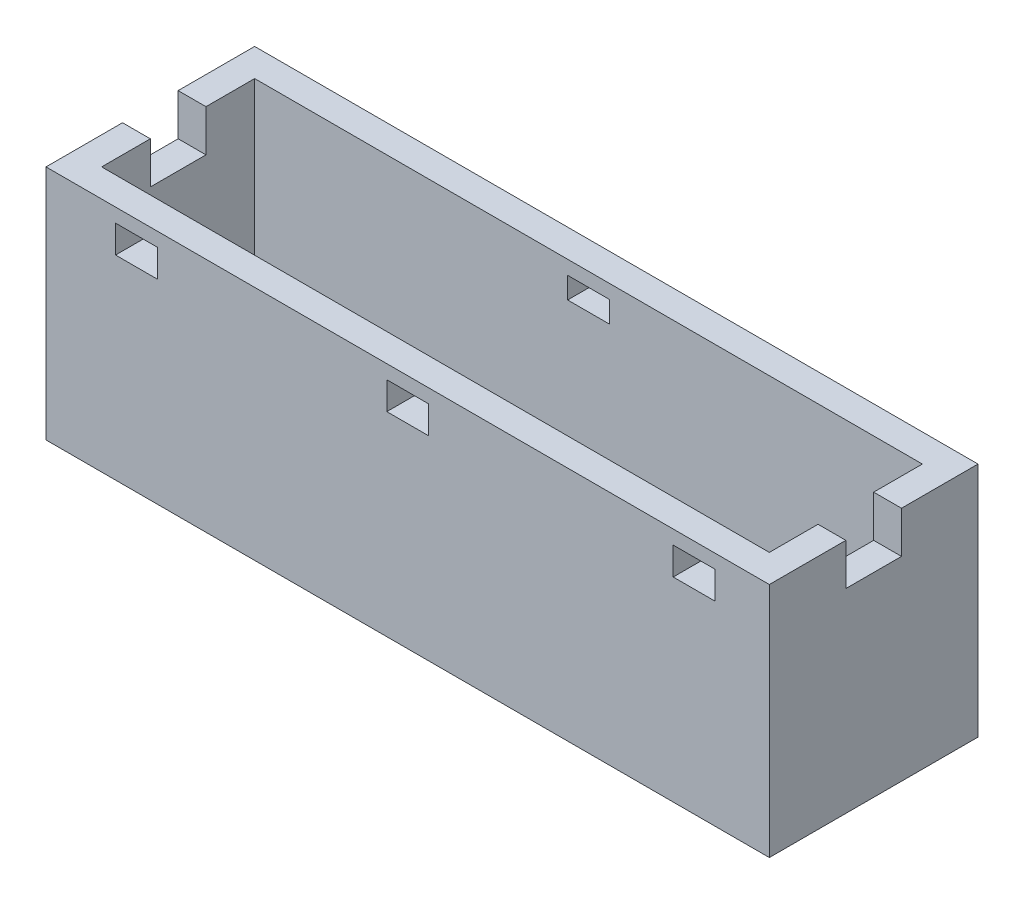
ISO-10303-21;
HEADER;
FILE_DESCRIPTION(('STEP AP214'),'2;1');
FILE_NAME('part.step','',(''),(''),'','','');
FILE_SCHEMA(('AUTOMOTIVE_DESIGN { 1 0 10303 214 1 1 1 1 }'));
ENDSEC;
DATA;
#1=APPLICATION_CONTEXT('core data for automotive mechanical design processes');
#2=APPLICATION_PROTOCOL_DEFINITION('international standard','automotive_design',2000,#1);
#3=PRODUCT_CONTEXT('',#1,'mechanical');
#4=PRODUCT('Part','Part','',(#3));
#5=PRODUCT_RELATED_PRODUCT_CATEGORY('part','',(#4));
#6=PRODUCT_DEFINITION_FORMATION('','',#4);
#7=PRODUCT_DEFINITION_CONTEXT('part definition',#1,'design');
#8=PRODUCT_DEFINITION('design','',#6,#7);
#9=PRODUCT_DEFINITION_SHAPE('','',#8);
#10=(LENGTH_UNIT() NAMED_UNIT(*) SI_UNIT(.MILLI.,.METRE.));
#11=(NAMED_UNIT(*) PLANE_ANGLE_UNIT() SI_UNIT($,.RADIAN.));
#12=(NAMED_UNIT(*) SI_UNIT($,.STERADIAN.) SOLID_ANGLE_UNIT());
#13=UNCERTAINTY_MEASURE_WITH_UNIT(LENGTH_MEASURE(1.E-05),#10,'distance_accuracy_value','');
#14=(GEOMETRIC_REPRESENTATION_CONTEXT(3) GLOBAL_UNCERTAINTY_ASSIGNED_CONTEXT((#13)) GLOBAL_UNIT_ASSIGNED_CONTEXT((#10,
#11,#12)) REPRESENTATION_CONTEXT('',''));
#15=CARTESIAN_POINT('',(0.,0.,0.));
#16=DIRECTION('',(0.,0.,1.));
#17=DIRECTION('',(1.,0.,0.));
#18=AXIS2_PLACEMENT_3D('',#15,#16,#17);
#19=CARTESIAN_POINT('',(0.,140.,0.));
#20=DIRECTION('',(0.,1.,0.));
#21=DIRECTION('',(0.,0.,1.));
#22=AXIS2_PLACEMENT_3D('',#19,#20,#21);
#23=PLANE('',#22);
#24=DIRECTION('',(-1.,0.,0.));
#25=VECTOR('',#24,1.);
#26=CARTESIAN_POINT('',(260.,140.,-20.0000000000002));
#27=LINE('',#26,#25);
#28=CARTESIAN_POINT('',(260.,140.,-20.0000000000002));
#29=VERTEX_POINT('',#28);
#30=CARTESIAN_POINT('',(240.,140.,-20.0000000000002));
#31=VERTEX_POINT('',#30);
#32=EDGE_CURVE('E366',#29,#31,#27,.T.);
#33=ORIENTED_EDGE('',*,*,#32,.F.);
#34=DIRECTION('',(0.,0.,-1.));
#35=VECTOR('',#34,1.);
#36=CARTESIAN_POINT('',(260.,140.,-75.));
#37=LINE('',#36,#35);
#38=CARTESIAN_POINT('',(260.,140.,-75.));
#39=VERTEX_POINT('',#38);
#40=EDGE_CURVE('E417',#29,#39,#37,.T.);
#41=ORIENTED_EDGE('',*,*,#40,.T.);
#42=DIRECTION('',(-1.,0.,0.));
#43=VECTOR('',#42,1.);
#44=CARTESIAN_POINT('',(-260.,140.,-75.));
#45=LINE('',#44,#43);
#46=CARTESIAN_POINT('',(15.,140.,-75.));
#47=VERTEX_POINT('',#46);
#48=EDGE_CURVE('E429',#39,#47,#45,.T.);
#49=ORIENTED_EDGE('',*,*,#48,.T.);
#50=CARTESIAN_POINT('',(-15.0000000000001,140.,-75.));
#51=VERTEX_POINT('',#50);
#52=EDGE_CURVE('E433',#47,#51,#45,.T.);
#53=ORIENTED_EDGE('',*,*,#52,.T.);
#54=CARTESIAN_POINT('',(-260.,140.,-75.));
#55=VERTEX_POINT('',#54);
#56=EDGE_CURVE('E428',#51,#55,#45,.T.);
#57=ORIENTED_EDGE('',*,*,#56,.T.);
#58=DIRECTION('',(0.,0.,1.));
#59=VECTOR('',#58,1.);
#60=CARTESIAN_POINT('',(-260.,140.,-75.));
#61=LINE('',#60,#59);
#62=CARTESIAN_POINT('',(-260.,140.,-20.));
#63=VERTEX_POINT('',#62);
#64=EDGE_CURVE('E434',#55,#63,#61,.T.);
#65=ORIENTED_EDGE('',*,*,#64,.T.);
#66=CARTESIAN_POINT('',(-240.,140.,-20.));
#67=VERTEX_POINT('',#66);
#68=EDGE_CURVE('E369',#67,#63,#27,.T.);
#69=ORIENTED_EDGE('',*,*,#68,.F.);
#70=DIRECTION('',(0.,0.,1.));
#71=VECTOR('',#70,1.);
#72=CARTESIAN_POINT('',(-240.,140.,-55.));
#73=LINE('',#72,#71);
#74=CARTESIAN_POINT('',(-240.,140.,-55.));
#75=VERTEX_POINT('',#74);
#76=EDGE_CURVE('E410',#75,#67,#73,.T.);
#77=ORIENTED_EDGE('',*,*,#76,.F.);
#78=DIRECTION('',(-1.,0.,0.));
#79=VECTOR('',#78,1.);
#80=CARTESIAN_POINT('',(-240.,140.,-55.));
#81=LINE('',#80,#79);
#82=CARTESIAN_POINT('',(240.,140.,-55.));
#83=VERTEX_POINT('',#82);
#84=EDGE_CURVE('E406',#83,#75,#81,.T.);
#85=ORIENTED_EDGE('',*,*,#84,.F.);
#86=DIRECTION('',(0.,0.,-1.));
#87=VECTOR('',#86,1.);
#88=CARTESIAN_POINT('',(240.,140.,-55.));
#89=LINE('',#88,#87);
#90=EDGE_CURVE('E388',#31,#83,#89,.T.);
#91=ORIENTED_EDGE('',*,*,#90,.F.);
#92=EDGE_LOOP('',(#33,#41,#49,#53,#57,#65,#69,#77,#85,#91));
#93=FACE_BOUND('',#92,.T.);
#94=ADVANCED_FACE('F35',(#93),#23,.T.);
#95=CARTESIAN_POINT('',(260.,140.,-75.));
#96=DIRECTION('',(-1.,0.,0.));
#97=DIRECTION('',(0.,0.,1.));
#98=AXIS2_PLACEMENT_3D('',#95,#96,#97);
#99=PLANE('',#98);
#100=ORIENTED_EDGE('',*,*,#40,.F.);
#101=DIRECTION('',(0.,-1.,0.));
#102=VECTOR('',#101,1.);
#103=CARTESIAN_POINT('',(260.,140.,-20.0000000000002));
#104=LINE('',#103,#102);
#105=CARTESIAN_POINT('',(260.,110.,-20.0000000000002));
#106=VERTEX_POINT('',#105);
#107=EDGE_CURVE('E349',#29,#106,#104,.T.);
#108=ORIENTED_EDGE('',*,*,#107,.T.);
#109=DIRECTION('',(0.,0.,1.));
#110=VECTOR('',#109,1.);
#111=CARTESIAN_POINT('',(260.,110.,-20.0000000000002));
#112=LINE('',#111,#110);
#113=CARTESIAN_POINT('',(260.,110.,19.9999999999998));
#114=VERTEX_POINT('',#113);
#115=EDGE_CURVE('E352',#106,#114,#112,.T.);
#116=ORIENTED_EDGE('',*,*,#115,.T.);
#117=DIRECTION('',(0.,1.,0.));
#118=VECTOR('',#117,1.);
#119=CARTESIAN_POINT('',(260.,140.,19.9999999999998));
#120=LINE('',#119,#118);
#121=CARTESIAN_POINT('',(260.,140.,19.9999999999998));
#122=VERTEX_POINT('',#121);
#123=EDGE_CURVE('E356',#114,#122,#120,.T.);
#124=ORIENTED_EDGE('',*,*,#123,.T.);
#125=CARTESIAN_POINT('',(260.,140.,75.));
#126=VERTEX_POINT('',#125);
#127=EDGE_CURVE('E425',#126,#122,#37,.T.);
#128=ORIENTED_EDGE('',*,*,#127,.F.);
#129=DIRECTION('',(0.,-1.,0.));
#130=VECTOR('',#129,1.);
#131=CARTESIAN_POINT('',(260.,140.,75.));
#132=LINE('',#131,#130);
#133=CARTESIAN_POINT('',(260.,-30.,75.));
#134=VERTEX_POINT('',#133);
#135=EDGE_CURVE('E439',#126,#134,#132,.T.);
#136=ORIENTED_EDGE('',*,*,#135,.T.);
#137=DIRECTION('',(0.,0.,1.));
#138=VECTOR('',#137,1.);
#139=CARTESIAN_POINT('',(260.,-30.,-75.));
#140=LINE('',#139,#138);
#141=CARTESIAN_POINT('',(260.,-30.,-75.));
#142=VERTEX_POINT('',#141);
#143=EDGE_CURVE('E342',#142,#134,#140,.T.);
#144=ORIENTED_EDGE('',*,*,#143,.F.);
#145=DIRECTION('',(0.,-1.,0.));
#146=VECTOR('',#145,1.);
#147=CARTESIAN_POINT('',(260.,140.,-75.));
#148=LINE('',#147,#146);
#149=EDGE_CURVE('E445',#39,#142,#148,.T.);
#150=ORIENTED_EDGE('',*,*,#149,.F.);
#151=EDGE_LOOP('',(#100,#108,#116,#124,#128,#136,#144,#150));
#152=FACE_BOUND('',#151,.T.);
#153=ADVANCED_FACE('F524',(#152),#99,.F.);
#154=CARTESIAN_POINT('',(-260.,140.,-75.));
#155=DIRECTION('',(0.,0.,1.));
#156=DIRECTION('',(1.,0.,0.));
#157=AXIS2_PLACEMENT_3D('',#154,#155,#156);
#158=PLANE('',#157);
#159=DIRECTION('',(0.,-1.,0.));
#160=VECTOR('',#159,1.);
#161=CARTESIAN_POINT('',(15.,130.,-75.));
#162=LINE('',#161,#160);
#163=CARTESIAN_POINT('',(15.,114.647041027345,-75.));
#164=VERTEX_POINT('',#163);
#165=EDGE_CURVE('E320',#47,#164,#162,.T.);
#166=ORIENTED_EDGE('',*,*,#165,.F.);
#167=ORIENTED_EDGE('',*,*,#48,.F.);
#168=ORIENTED_EDGE('',*,*,#149,.T.);
#169=DIRECTION('',(1.,0.,0.));
#170=VECTOR('',#169,1.);
#171=CARTESIAN_POINT('',(-260.,-30.,-75.));
#172=LINE('',#171,#170);
#173=CARTESIAN_POINT('',(-260.,-30.,-75.));
#174=VERTEX_POINT('',#173);
#175=EDGE_CURVE('E339',#174,#142,#172,.T.);
#176=ORIENTED_EDGE('',*,*,#175,.F.);
#177=DIRECTION('',(0.,-1.,0.));
#178=VECTOR('',#177,1.);
#179=CARTESIAN_POINT('',(-260.,140.,-75.));
#180=LINE('',#179,#178);
#181=EDGE_CURVE('E443',#55,#174,#180,.T.);
#182=ORIENTED_EDGE('',*,*,#181,.F.);
#183=ORIENTED_EDGE('',*,*,#56,.F.);
#184=DIRECTION('',(0.,1.,0.));
#185=VECTOR('',#184,1.);
#186=CARTESIAN_POINT('',(-15.0000000000001,130.,-75.));
#187=LINE('',#186,#185);
#188=CARTESIAN_POINT('',(-15.0000000000001,114.647041027345,-75.));
#189=VERTEX_POINT('',#188);
#190=EDGE_CURVE('E312',#189,#51,#187,.T.);
#191=ORIENTED_EDGE('',*,*,#190,.F.);
#192=DIRECTION('',(-1.,0.,0.));
#193=VECTOR('',#192,1.);
#194=CARTESIAN_POINT('',(15.,114.647041027345,-75.));
#195=LINE('',#194,#193);
#196=EDGE_CURVE('E323',#164,#189,#195,.T.);
#197=ORIENTED_EDGE('',*,*,#196,.F.);
#198=EDGE_LOOP('',(#166,#167,#168,#176,#182,#183,#191,#197));
#199=FACE_BOUND('',#198,.T.);
#200=ADVANCED_FACE('F531',(#199),#158,.F.);
#201=CARTESIAN_POINT('',(-260.,140.,-75.));
#202=DIRECTION('',(1.,0.,0.));
#203=DIRECTION('',(0.,0.,-1.));
#204=AXIS2_PLACEMENT_3D('',#201,#202,#203);
#205=PLANE('',#204);
#206=DIRECTION('',(0.,0.,1.));
#207=VECTOR('',#206,1.);
#208=CARTESIAN_POINT('',(-260.,110.,-20.));
#209=LINE('',#208,#207);
#210=CARTESIAN_POINT('',(-260.,110.,-20.));
#211=VERTEX_POINT('',#210);
#212=CARTESIAN_POINT('',(-260.,110.,20.));
#213=VERTEX_POINT('',#212);
#214=EDGE_CURVE('E362',#211,#213,#209,.T.);
#215=ORIENTED_EDGE('',*,*,#214,.F.);
#216=DIRECTION('',(0.,-1.,0.));
#217=VECTOR('',#216,1.);
#218=CARTESIAN_POINT('',(-260.,140.,-20.));
#219=LINE('',#218,#217);
#220=EDGE_CURVE('E348',#63,#211,#219,.T.);
#221=ORIENTED_EDGE('',*,*,#220,.F.);
#222=ORIENTED_EDGE('',*,*,#64,.F.);
#223=ORIENTED_EDGE('',*,*,#181,.T.);
#224=DIRECTION('',(0.,0.,-1.));
#225=VECTOR('',#224,1.);
#226=CARTESIAN_POINT('',(-260.,-30.,-75.));
#227=LINE('',#226,#225);
#228=CARTESIAN_POINT('',(-260.,-30.,75.));
#229=VERTEX_POINT('',#228);
#230=EDGE_CURVE('E329',#229,#174,#227,.T.);
#231=ORIENTED_EDGE('',*,*,#230,.F.);
#232=DIRECTION('',(0.,-1.,0.));
#233=VECTOR('',#232,1.);
#234=CARTESIAN_POINT('',(-260.,140.,75.));
#235=LINE('',#234,#233);
#236=CARTESIAN_POINT('',(-260.,140.,75.));
#237=VERTEX_POINT('',#236);
#238=EDGE_CURVE('E441',#237,#229,#235,.T.);
#239=ORIENTED_EDGE('',*,*,#238,.F.);
#240=CARTESIAN_POINT('',(-260.,140.,20.));
#241=VERTEX_POINT('',#240);
#242=EDGE_CURVE('E432',#241,#237,#61,.T.);
#243=ORIENTED_EDGE('',*,*,#242,.F.);
#244=DIRECTION('',(0.,1.,0.));
#245=VECTOR('',#244,1.);
#246=CARTESIAN_POINT('',(-260.,140.,20.));
#247=LINE('',#246,#245);
#248=EDGE_CURVE('E353',#213,#241,#247,.T.);
#249=ORIENTED_EDGE('',*,*,#248,.F.);
#250=EDGE_LOOP('',(#215,#221,#222,#223,#231,#239,#243,#249));
#251=FACE_BOUND('',#250,.T.);
#252=ADVANCED_FACE('F544',(#251),#205,.F.);
#253=CARTESIAN_POINT('',(-260.,140.,75.));
#254=DIRECTION('',(0.,0.,-1.));
#255=DIRECTION('',(-1.,0.,0.));
#256=AXIS2_PLACEMENT_3D('',#253,#254,#255);
#257=PLANE('',#256);
#258=DIRECTION('',(-1.,0.,0.));
#259=VECTOR('',#258,1.);
#260=CARTESIAN_POINT('',(190.891066665378,130.,75.));
#261=LINE('',#260,#259);
#262=CARTESIAN_POINT('',(220.891066665378,130.,75.));
#263=VERTEX_POINT('',#262);
#264=CARTESIAN_POINT('',(190.891066665378,130.,75.));
#265=VERTEX_POINT('',#264);
#266=EDGE_CURVE('E262',#263,#265,#261,.T.);
#267=ORIENTED_EDGE('',*,*,#266,.F.);
#268=DIRECTION('',(0.,1.,0.));
#269=VECTOR('',#268,1.);
#270=CARTESIAN_POINT('',(220.891066665378,130.,75.));
#271=LINE('',#270,#269);
#272=CARTESIAN_POINT('',(220.891066665378,110.12,75.));
#273=VERTEX_POINT('',#272);
#274=EDGE_CURVE('E50',#273,#263,#271,.T.);
#275=ORIENTED_EDGE('',*,*,#274,.F.);
#276=DIRECTION('',(1.,0.,0.));
#277=VECTOR('',#276,1.);
#278=CARTESIAN_POINT('',(190.891066665378,110.12,75.));
#279=LINE('',#278,#277);
#280=CARTESIAN_POINT('',(190.891066665378,110.12,75.));
#281=VERTEX_POINT('',#280);
#282=EDGE_CURVE('E269',#281,#273,#279,.T.);
#283=ORIENTED_EDGE('',*,*,#282,.F.);
#284=DIRECTION('',(0.,-1.,0.));
#285=VECTOR('',#284,1.);
#286=CARTESIAN_POINT('',(190.891066665378,130.,75.));
#287=LINE('',#286,#285);
#288=EDGE_CURVE('E253',#265,#281,#287,.T.);
#289=ORIENTED_EDGE('',*,*,#288,.F.);
#290=EDGE_LOOP('',(#267,#275,#283,#289));
#291=FACE_BOUND('',#290,.T.);
#292=DIRECTION('',(-1.,0.,0.));
#293=VECTOR('',#292,1.);
#294=CARTESIAN_POINT('',(-15.,130.,75.));
#295=LINE('',#294,#293);
#296=CARTESIAN_POINT('',(15.0000000000001,130.,75.));
#297=VERTEX_POINT('',#296);
#298=CARTESIAN_POINT('',(-15.,130.,75.));
#299=VERTEX_POINT('',#298);
#300=EDGE_CURVE('E280',#297,#299,#295,.T.);
#301=ORIENTED_EDGE('',*,*,#300,.F.);
#302=DIRECTION('',(0.,1.,0.));
#303=VECTOR('',#302,1.);
#304=CARTESIAN_POINT('',(15.,130.,75.));
#305=LINE('',#304,#303);
#306=CARTESIAN_POINT('',(15.,110.12,75.));
#307=VERTEX_POINT('',#306);
#308=EDGE_CURVE('E276',#307,#297,#305,.T.);
#309=ORIENTED_EDGE('',*,*,#308,.F.);
#310=DIRECTION('',(1.,0.,0.));
#311=VECTOR('',#310,1.);
#312=CARTESIAN_POINT('',(-15.,110.12,75.));
#313=LINE('',#312,#311);
#314=CARTESIAN_POINT('',(-15.,110.12,75.));
#315=VERTEX_POINT('',#314);
#316=EDGE_CURVE('E286',#315,#307,#313,.T.);
#317=ORIENTED_EDGE('',*,*,#316,.F.);
#318=DIRECTION('',(0.,-1.,0.));
#319=VECTOR('',#318,1.);
#320=CARTESIAN_POINT('',(-15.,130.,75.));
#321=LINE('',#320,#319);
#322=EDGE_CURVE('E283',#299,#315,#321,.T.);
#323=ORIENTED_EDGE('',*,*,#322,.F.);
#324=EDGE_LOOP('',(#301,#309,#317,#323));
#325=FACE_BOUND('',#324,.T.);
#326=DIRECTION('',(-1.,0.,0.));
#327=VECTOR('',#326,1.);
#328=CARTESIAN_POINT('',(-210.,130.,75.));
#329=LINE('',#328,#327);
#330=CARTESIAN_POINT('',(-180.,130.,75.));
#331=VERTEX_POINT('',#330);
#332=CARTESIAN_POINT('',(-210.,130.,75.));
#333=VERTEX_POINT('',#332);
#334=EDGE_CURVE('E300',#331,#333,#329,.T.);
#335=ORIENTED_EDGE('',*,*,#334,.F.);
#336=DIRECTION('',(0.,1.,0.));
#337=VECTOR('',#336,1.);
#338=CARTESIAN_POINT('',(-180.,130.,75.));
#339=LINE('',#338,#337);
#340=CARTESIAN_POINT('',(-180.,110.124383724971,75.));
#341=VERTEX_POINT('',#340);
#342=EDGE_CURVE('E292',#341,#331,#339,.T.);
#343=ORIENTED_EDGE('',*,*,#342,.F.);
#344=DIRECTION('',(1.,0.,0.));
#345=VECTOR('',#344,1.);
#346=CARTESIAN_POINT('',(-210.,110.124383724971,75.));
#347=LINE('',#346,#345);
#348=CARTESIAN_POINT('',(-210.,110.124383724971,75.));
#349=VERTEX_POINT('',#348);
#350=EDGE_CURVE('E306',#349,#341,#347,.T.);
#351=ORIENTED_EDGE('',*,*,#350,.F.);
#352=DIRECTION('',(0.,-1.,0.));
#353=VECTOR('',#352,1.);
#354=CARTESIAN_POINT('',(-210.,130.,75.));
#355=LINE('',#354,#353);
#356=EDGE_CURVE('E303',#333,#349,#355,.T.);
#357=ORIENTED_EDGE('',*,*,#356,.F.);
#358=EDGE_LOOP('',(#335,#343,#351,#357));
#359=FACE_BOUND('',#358,.T.);
#360=ORIENTED_EDGE('',*,*,#238,.T.);
#361=DIRECTION('',(-1.,0.,0.));
#362=VECTOR('',#361,1.);
#363=CARTESIAN_POINT('',(-260.,-30.,75.));
#364=LINE('',#363,#362);
#365=EDGE_CURVE('E345',#134,#229,#364,.T.);
#366=ORIENTED_EDGE('',*,*,#365,.F.);
#367=ORIENTED_EDGE('',*,*,#135,.F.);
#368=DIRECTION('',(1.,0.,0.));
#369=VECTOR('',#368,1.);
#370=CARTESIAN_POINT('',(-260.,140.,75.));
#371=LINE('',#370,#369);
#372=EDGE_CURVE('E437',#237,#126,#371,.T.);
#373=ORIENTED_EDGE('',*,*,#372,.F.);
#374=EDGE_LOOP('',(#360,#366,#367,#373));
#375=FACE_BOUND('',#374,.T.);
#376=ADVANCED_FACE('F266',(#291,#325,#359,#375),#257,.F.);
#377=DIRECTION('',(-1.,0.,0.));
#378=VECTOR('',#377,1.);
#379=CARTESIAN_POINT('',(260.,140.,19.9999999999998));
#380=LINE('',#379,#378);
#381=CARTESIAN_POINT('',(-240.,140.,20.));
#382=VERTEX_POINT('',#381);
#383=EDGE_CURVE('E373',#382,#241,#380,.T.);
#384=ORIENTED_EDGE('',*,*,#383,.T.);
#385=ORIENTED_EDGE('',*,*,#242,.T.);
#386=ORIENTED_EDGE('',*,*,#372,.T.);
#387=ORIENTED_EDGE('',*,*,#127,.T.);
#388=CARTESIAN_POINT('',(240.,140.,19.9999999999998));
#389=VERTEX_POINT('',#388);
#390=EDGE_CURVE('E370',#122,#389,#380,.T.);
#391=ORIENTED_EDGE('',*,*,#390,.T.);
#392=CARTESIAN_POINT('',(240.,140.,55.));
#393=VERTEX_POINT('',#392);
#394=EDGE_CURVE('E403',#393,#389,#89,.T.);
#395=ORIENTED_EDGE('',*,*,#394,.F.);
#396=DIRECTION('',(1.,0.,0.));
#397=VECTOR('',#396,1.);
#398=CARTESIAN_POINT('',(-240.,140.,55.));
#399=LINE('',#398,#397);
#400=CARTESIAN_POINT('',(-240.,140.,55.));
#401=VERTEX_POINT('',#400);
#402=EDGE_CURVE('E393',#401,#393,#399,.T.);
#403=ORIENTED_EDGE('',*,*,#402,.F.);
#404=EDGE_CURVE('E409',#382,#401,#73,.T.);
#405=ORIENTED_EDGE('',*,*,#404,.F.);
#406=EDGE_LOOP('',(#384,#385,#386,#387,#391,#395,#403,#405));
#407=FACE_BOUND('',#406,.T.);
#408=ADVANCED_FACE('F527',(#407),#23,.T.);
#409=CARTESIAN_POINT('',(240.,20.,-55.));
#410=DIRECTION('',(1.,0.,0.));
#411=DIRECTION('',(0.,0.,-1.));
#412=AXIS2_PLACEMENT_3D('',#409,#410,#411);
#413=PLANE('',#412);
#414=DIRECTION('',(0.,0.,-1.));
#415=VECTOR('',#414,1.);
#416=CARTESIAN_POINT('',(240.,110.,-55.));
#417=LINE('',#416,#415);
#418=CARTESIAN_POINT('',(240.,110.,19.9999999999998));
#419=VERTEX_POINT('',#418);
#420=CARTESIAN_POINT('',(240.,110.,-20.0000000000002));
#421=VERTEX_POINT('',#420);
#422=EDGE_CURVE('E368',#419,#421,#417,.T.);
#423=ORIENTED_EDGE('',*,*,#422,.T.);
#424=DIRECTION('',(0.,1.,0.));
#425=VECTOR('',#424,1.);
#426=CARTESIAN_POINT('',(240.,20.,-20.0000000000002));
#427=LINE('',#426,#425);
#428=EDGE_CURVE('E385',#421,#31,#427,.T.);
#429=ORIENTED_EDGE('',*,*,#428,.T.);
#430=ORIENTED_EDGE('',*,*,#90,.T.);
#431=DIRECTION('',(0.,1.,0.));
#432=VECTOR('',#431,1.);
#433=CARTESIAN_POINT('',(240.,20.,-55.));
#434=LINE('',#433,#432);
#435=CARTESIAN_POINT('',(240.,20.,-55.));
#436=VERTEX_POINT('',#435);
#437=EDGE_CURVE('E402',#436,#83,#434,.T.);
#438=ORIENTED_EDGE('',*,*,#437,.F.);
#439=DIRECTION('',(0.,0.,-1.));
#440=VECTOR('',#439,1.);
#441=CARTESIAN_POINT('',(240.,20.,-55.));
#442=LINE('',#441,#440);
#443=CARTESIAN_POINT('',(240.,20.,55.));
#444=VERTEX_POINT('',#443);
#445=EDGE_CURVE('E389',#444,#436,#442,.T.);
#446=ORIENTED_EDGE('',*,*,#445,.F.);
#447=DIRECTION('',(0.,1.,0.));
#448=VECTOR('',#447,1.);
#449=CARTESIAN_POINT('',(240.,20.,55.));
#450=LINE('',#449,#448);
#451=EDGE_CURVE('E415',#444,#393,#450,.T.);
#452=ORIENTED_EDGE('',*,*,#451,.T.);
#453=ORIENTED_EDGE('',*,*,#394,.T.);
#454=DIRECTION('',(0.,-1.,0.));
#455=VECTOR('',#454,1.);
#456=CARTESIAN_POINT('',(240.,20.,19.9999999999998));
#457=LINE('',#456,#455);
#458=EDGE_CURVE('E382',#389,#419,#457,.T.);
#459=ORIENTED_EDGE('',*,*,#458,.T.);
#460=EDGE_LOOP('',(#423,#429,#430,#438,#446,#452,#453,#459));
#461=FACE_BOUND('',#460,.T.);
#462=ADVANCED_FACE('F537',(#461),#413,.F.);
#463=CARTESIAN_POINT('',(-240.,20.,55.));
#464=DIRECTION('',(0.,0.,1.));
#465=DIRECTION('',(1.,0.,0.));
#466=AXIS2_PLACEMENT_3D('',#463,#464,#465);
#467=PLANE('',#466);
#468=DIRECTION('',(1.,0.,0.));
#469=VECTOR('',#468,1.);
#470=CARTESIAN_POINT('',(-240.,110.12,55.));
#471=LINE('',#470,#469);
#472=CARTESIAN_POINT('',(190.891066665378,110.12,55.));
#473=VERTEX_POINT('',#472);
#474=CARTESIAN_POINT('',(220.891066665378,110.12,55.));
#475=VERTEX_POINT('',#474);
#476=EDGE_CURVE('E43',#473,#475,#471,.T.);
#477=ORIENTED_EDGE('',*,*,#476,.T.);
#478=DIRECTION('',(0.,1.,0.));
#479=VECTOR('',#478,1.);
#480=CARTESIAN_POINT('',(220.891066665378,20.,55.));
#481=LINE('',#480,#479);
#482=CARTESIAN_POINT('',(220.891066665378,130.,55.));
#483=VERTEX_POINT('',#482);
#484=EDGE_CURVE('E11',#475,#483,#481,.T.);
#485=ORIENTED_EDGE('',*,*,#484,.T.);
#486=DIRECTION('',(-1.,0.,0.));
#487=VECTOR('',#486,1.);
#488=CARTESIAN_POINT('',(-240.,130.,55.));
#489=LINE('',#488,#487);
#490=CARTESIAN_POINT('',(190.891066665378,130.,55.));
#491=VERTEX_POINT('',#490);
#492=EDGE_CURVE('E500',#483,#491,#489,.T.);
#493=ORIENTED_EDGE('',*,*,#492,.T.);
#494=DIRECTION('',(0.,-1.,0.));
#495=VECTOR('',#494,1.);
#496=CARTESIAN_POINT('',(190.891066665378,20.,55.));
#497=LINE('',#496,#495);
#498=EDGE_CURVE('E256',#491,#473,#497,.T.);
#499=ORIENTED_EDGE('',*,*,#498,.T.);
#500=EDGE_LOOP('',(#477,#485,#493,#499));
#501=FACE_BOUND('',#500,.T.);
#502=DIRECTION('',(1.,0.,0.));
#503=VECTOR('',#502,1.);
#504=CARTESIAN_POINT('',(-240.,110.12,55.));
#505=LINE('',#504,#503);
#506=CARTESIAN_POINT('',(-15.,110.12,55.));
#507=VERTEX_POINT('',#506);
#508=CARTESIAN_POINT('',(15.,110.12,55.));
#509=VERTEX_POINT('',#508);
#510=EDGE_CURVE('E494',#507,#509,#505,.T.);
#511=ORIENTED_EDGE('',*,*,#510,.T.);
#512=DIRECTION('',(0.,1.,0.));
#513=VECTOR('',#512,1.);
#514=CARTESIAN_POINT('',(15.,20.,55.));
#515=LINE('',#514,#513);
#516=CARTESIAN_POINT('',(15.,130.,55.));
#517=VERTEX_POINT('',#516);
#518=EDGE_CURVE('E497',#509,#517,#515,.T.);
#519=ORIENTED_EDGE('',*,*,#518,.T.);
#520=DIRECTION('',(-1.,0.,0.));
#521=VECTOR('',#520,1.);
#522=CARTESIAN_POINT('',(-240.,130.,55.));
#523=LINE('',#522,#521);
#524=CARTESIAN_POINT('',(-15.,130.,55.));
#525=VERTEX_POINT('',#524);
#526=EDGE_CURVE('E488',#517,#525,#523,.T.);
#527=ORIENTED_EDGE('',*,*,#526,.T.);
#528=DIRECTION('',(0.,-1.,0.));
#529=VECTOR('',#528,1.);
#530=CARTESIAN_POINT('',(-15.,20.,55.));
#531=LINE('',#530,#529);
#532=EDGE_CURVE('E491',#525,#507,#531,.T.);
#533=ORIENTED_EDGE('',*,*,#532,.T.);
#534=EDGE_LOOP('',(#511,#519,#527,#533));
#535=FACE_BOUND('',#534,.T.);
#536=DIRECTION('',(1.,0.,0.));
#537=VECTOR('',#536,1.);
#538=CARTESIAN_POINT('',(-240.,110.124383724971,55.));
#539=LINE('',#538,#537);
#540=CARTESIAN_POINT('',(-210.,110.124383724971,55.));
#541=VERTEX_POINT('',#540);
#542=CARTESIAN_POINT('',(-180.,110.124383724971,55.));
#543=VERTEX_POINT('',#542);
#544=EDGE_CURVE('E482',#541,#543,#539,.T.);
#545=ORIENTED_EDGE('',*,*,#544,.T.);
#546=DIRECTION('',(0.,1.,0.));
#547=VECTOR('',#546,1.);
#548=CARTESIAN_POINT('',(-180.,20.0000000000001,55.));
#549=LINE('',#548,#547);
#550=CARTESIAN_POINT('',(-180.,130.,55.));
#551=VERTEX_POINT('',#550);
#552=EDGE_CURVE('E485',#543,#551,#549,.T.);
#553=ORIENTED_EDGE('',*,*,#552,.T.);
#554=DIRECTION('',(-1.,0.,0.));
#555=VECTOR('',#554,1.);
#556=CARTESIAN_POINT('',(-240.,130.,55.));
#557=LINE('',#556,#555);
#558=CARTESIAN_POINT('',(-210.,130.,55.));
#559=VERTEX_POINT('',#558);
#560=EDGE_CURVE('E476',#551,#559,#557,.T.);
#561=ORIENTED_EDGE('',*,*,#560,.T.);
#562=DIRECTION('',(0.,-1.,0.));
#563=VECTOR('',#562,1.);
#564=CARTESIAN_POINT('',(-210.,20.,55.));
#565=LINE('',#564,#563);
#566=EDGE_CURVE('E479',#559,#541,#565,.T.);
#567=ORIENTED_EDGE('',*,*,#566,.T.);
#568=EDGE_LOOP('',(#545,#553,#561,#567));
#569=FACE_BOUND('',#568,.T.);
#570=ORIENTED_EDGE('',*,*,#402,.T.);
#571=ORIENTED_EDGE('',*,*,#451,.F.);
#572=DIRECTION('',(1.,0.,0.));
#573=VECTOR('',#572,1.);
#574=CARTESIAN_POINT('',(-240.,20.,55.));
#575=LINE('',#574,#573);
#576=CARTESIAN_POINT('',(-240.,20.,55.));
#577=VERTEX_POINT('',#576);
#578=EDGE_CURVE('E399',#577,#444,#575,.T.);
#579=ORIENTED_EDGE('',*,*,#578,.F.);
#580=DIRECTION('',(0.,1.,0.));
#581=VECTOR('',#580,1.);
#582=CARTESIAN_POINT('',(-240.,20.,55.));
#583=LINE('',#582,#581);
#584=EDGE_CURVE('E418',#577,#401,#583,.T.);
#585=ORIENTED_EDGE('',*,*,#584,.T.);
#586=EDGE_LOOP('',(#570,#571,#579,#585));
#587=FACE_BOUND('',#586,.T.);
#588=ADVANCED_FACE('F504',(#501,#535,#569,#587),#467,.F.);
#589=CARTESIAN_POINT('',(-240.,20.,-55.));
#590=DIRECTION('',(-1.,0.,0.));
#591=DIRECTION('',(0.,0.,1.));
#592=AXIS2_PLACEMENT_3D('',#589,#590,#591);
#593=PLANE('',#592);
#594=ORIENTED_EDGE('',*,*,#76,.T.);
#595=DIRECTION('',(0.,-1.,0.));
#596=VECTOR('',#595,1.);
#597=CARTESIAN_POINT('',(-240.,20.,-20.));
#598=LINE('',#597,#596);
#599=CARTESIAN_POINT('',(-240.,110.,-20.));
#600=VERTEX_POINT('',#599);
#601=EDGE_CURVE('E453',#67,#600,#598,.T.);
#602=ORIENTED_EDGE('',*,*,#601,.T.);
#603=DIRECTION('',(0.,0.,1.));
#604=VECTOR('',#603,1.);
#605=CARTESIAN_POINT('',(-240.,110.,-55.));
#606=LINE('',#605,#604);
#607=CARTESIAN_POINT('',(-240.,110.,20.));
#608=VERTEX_POINT('',#607);
#609=EDGE_CURVE('E447',#600,#608,#606,.T.);
#610=ORIENTED_EDGE('',*,*,#609,.T.);
#611=DIRECTION('',(0.,1.,0.));
#612=VECTOR('',#611,1.);
#613=CARTESIAN_POINT('',(-240.,20.,20.));
#614=LINE('',#613,#612);
#615=EDGE_CURVE('E450',#608,#382,#614,.T.);
#616=ORIENTED_EDGE('',*,*,#615,.T.);
#617=ORIENTED_EDGE('',*,*,#404,.T.);
#618=ORIENTED_EDGE('',*,*,#584,.F.);
#619=DIRECTION('',(0.,0.,1.));
#620=VECTOR('',#619,1.);
#621=CARTESIAN_POINT('',(-240.,20.,-55.));
#622=LINE('',#621,#620);
#623=CARTESIAN_POINT('',(-240.,20.,-55.));
#624=VERTEX_POINT('',#623);
#625=EDGE_CURVE('E396',#624,#577,#622,.T.);
#626=ORIENTED_EDGE('',*,*,#625,.F.);
#627=DIRECTION('',(0.,1.,0.));
#628=VECTOR('',#627,1.);
#629=CARTESIAN_POINT('',(-240.,20.,-55.));
#630=LINE('',#629,#628);
#631=EDGE_CURVE('E421',#624,#75,#630,.T.);
#632=ORIENTED_EDGE('',*,*,#631,.T.);
#633=EDGE_LOOP('',(#594,#602,#610,#616,#617,#618,#626,#632));
#634=FACE_BOUND('',#633,.T.);
#635=ADVANCED_FACE('F573',(#634),#593,.F.);
#636=CARTESIAN_POINT('',(-240.,20.,-55.));
#637=DIRECTION('',(0.,0.,-1.));
#638=DIRECTION('',(-1.,0.,0.));
#639=AXIS2_PLACEMENT_3D('',#636,#637,#638);
#640=PLANE('',#639);
#641=DIRECTION('',(-1.,0.,0.));
#642=VECTOR('',#641,1.);
#643=CARTESIAN_POINT('',(-240.,114.647041027345,-55.));
#644=LINE('',#643,#642);
#645=CARTESIAN_POINT('',(15.,114.647041027345,-55.));
#646=VERTEX_POINT('',#645);
#647=CARTESIAN_POINT('',(-15.0000000000001,114.647041027345,-55.));
#648=VERTEX_POINT('',#647);
#649=EDGE_CURVE('E462',#646,#648,#644,.T.);
#650=ORIENTED_EDGE('',*,*,#649,.T.);
#651=DIRECTION('',(0.,1.,0.));
#652=VECTOR('',#651,1.);
#653=CARTESIAN_POINT('',(-15.0000000000001,20.,-55.));
#654=LINE('',#653,#652);
#655=CARTESIAN_POINT('',(-15.0000000000001,130.,-55.));
#656=VERTEX_POINT('',#655);
#657=EDGE_CURVE('E465',#648,#656,#654,.T.);
#658=ORIENTED_EDGE('',*,*,#657,.T.);
#659=DIRECTION('',(1.,0.,0.));
#660=VECTOR('',#659,1.);
#661=CARTESIAN_POINT('',(-240.,130.,-55.));
#662=LINE('',#661,#660);
#663=CARTESIAN_POINT('',(15.,130.,-55.));
#664=VERTEX_POINT('',#663);
#665=EDGE_CURVE('E456',#656,#664,#662,.T.);
#666=ORIENTED_EDGE('',*,*,#665,.T.);
#667=DIRECTION('',(0.,-1.,0.));
#668=VECTOR('',#667,1.);
#669=CARTESIAN_POINT('',(14.9999999999999,20.,-55.));
#670=LINE('',#669,#668);
#671=EDGE_CURVE('E459',#664,#646,#670,.T.);
#672=ORIENTED_EDGE('',*,*,#671,.T.);
#673=EDGE_LOOP('',(#650,#658,#666,#672));
#674=FACE_BOUND('',#673,.T.);
#675=ORIENTED_EDGE('',*,*,#84,.T.);
#676=ORIENTED_EDGE('',*,*,#631,.F.);
#677=DIRECTION('',(-1.,0.,0.));
#678=VECTOR('',#677,1.);
#679=CARTESIAN_POINT('',(-240.,20.,-55.));
#680=LINE('',#679,#678);
#681=EDGE_CURVE('E392',#436,#624,#680,.T.);
#682=ORIENTED_EDGE('',*,*,#681,.F.);
#683=ORIENTED_EDGE('',*,*,#437,.T.);
#684=EDGE_LOOP('',(#675,#676,#682,#683));
#685=FACE_BOUND('',#684,.T.);
#686=ADVANCED_FACE('F578',(#674,#685),#640,.F.);
#687=CARTESIAN_POINT('',(0.,20.,0.));
#688=DIRECTION('',(0.,1.,0.));
#689=DIRECTION('',(0.,0.,1.));
#690=AXIS2_PLACEMENT_3D('',#687,#688,#689);
#691=PLANE('',#690);
#692=ORIENTED_EDGE('',*,*,#445,.T.);
#693=ORIENTED_EDGE('',*,*,#681,.T.);
#694=ORIENTED_EDGE('',*,*,#625,.T.);
#695=ORIENTED_EDGE('',*,*,#578,.T.);
#696=EDGE_LOOP('',(#692,#693,#694,#695));
#697=FACE_BOUND('',#696,.T.);
#698=ADVANCED_FACE('F575',(#697),#691,.T.);
#699=CARTESIAN_POINT('',(260.,110.,-20.0000000000002));
#700=DIRECTION('',(0.,-1.,0.));
#701=DIRECTION('',(0.,0.,-1.));
#702=AXIS2_PLACEMENT_3D('',#699,#700,#701);
#703=PLANE('',#702);
#704=DIRECTION('',(-1.,0.,0.));
#705=VECTOR('',#704,1.);
#706=CARTESIAN_POINT('',(260.,110.,-20.0000000000002));
#707=LINE('',#706,#705);
#708=EDGE_CURVE('E359',#600,#211,#707,.T.);
#709=ORIENTED_EDGE('',*,*,#708,.T.);
#710=ORIENTED_EDGE('',*,*,#214,.T.);
#711=DIRECTION('',(-1.,0.,0.));
#712=VECTOR('',#711,1.);
#713=CARTESIAN_POINT('',(260.,110.,19.9999999999998));
#714=LINE('',#713,#712);
#715=EDGE_CURVE('E377',#608,#213,#714,.T.);
#716=ORIENTED_EDGE('',*,*,#715,.F.);
#717=ORIENTED_EDGE('',*,*,#609,.F.);
#718=EDGE_LOOP('',(#709,#710,#716,#717));
#719=FACE_BOUND('',#718,.T.);
#720=ADVANCED_FACE('F589',(#719),#703,.F.);
#721=CARTESIAN_POINT('',(260.,140.,19.9999999999998));
#722=DIRECTION('',(0.,0.,1.));
#723=DIRECTION('',(1.,0.,0.));
#724=AXIS2_PLACEMENT_3D('',#721,#722,#723);
#725=PLANE('',#724);
#726=ORIENTED_EDGE('',*,*,#715,.T.);
#727=ORIENTED_EDGE('',*,*,#248,.T.);
#728=ORIENTED_EDGE('',*,*,#383,.F.);
#729=ORIENTED_EDGE('',*,*,#615,.F.);
#730=EDGE_LOOP('',(#726,#727,#728,#729));
#731=FACE_BOUND('',#730,.T.);
#732=ADVANCED_FACE('F590',(#731),#725,.F.);
#733=CARTESIAN_POINT('',(260.,140.,-20.0000000000002));
#734=DIRECTION('',(0.,0.,-1.));
#735=DIRECTION('',(-1.,0.,0.));
#736=AXIS2_PLACEMENT_3D('',#733,#734,#735);
#737=PLANE('',#736);
#738=ORIENTED_EDGE('',*,*,#68,.T.);
#739=ORIENTED_EDGE('',*,*,#220,.T.);
#740=ORIENTED_EDGE('',*,*,#708,.F.);
#741=ORIENTED_EDGE('',*,*,#601,.F.);
#742=EDGE_LOOP('',(#738,#739,#740,#741));
#743=FACE_BOUND('',#742,.T.);
#744=ADVANCED_FACE('F586',(#743),#737,.F.);
#745=EDGE_CURVE('E378',#106,#421,#707,.T.);
#746=ORIENTED_EDGE('',*,*,#745,.F.);
#747=ORIENTED_EDGE('',*,*,#107,.F.);
#748=ORIENTED_EDGE('',*,*,#32,.T.);
#749=ORIENTED_EDGE('',*,*,#428,.F.);
#750=EDGE_LOOP('',(#746,#747,#748,#749));
#751=FACE_BOUND('',#750,.T.);
#752=ADVANCED_FACE('F597',(#751),#737,.F.);
#753=ORIENTED_EDGE('',*,*,#390,.F.);
#754=ORIENTED_EDGE('',*,*,#123,.F.);
#755=EDGE_CURVE('E374',#114,#419,#714,.T.);
#756=ORIENTED_EDGE('',*,*,#755,.T.);
#757=ORIENTED_EDGE('',*,*,#458,.F.);
#758=EDGE_LOOP('',(#753,#754,#756,#757));
#759=FACE_BOUND('',#758,.T.);
#760=ADVANCED_FACE('F567',(#759),#725,.F.);
#761=ORIENTED_EDGE('',*,*,#755,.F.);
#762=ORIENTED_EDGE('',*,*,#115,.F.);
#763=ORIENTED_EDGE('',*,*,#745,.T.);
#764=ORIENTED_EDGE('',*,*,#422,.F.);
#765=EDGE_LOOP('',(#761,#762,#763,#764));
#766=FACE_BOUND('',#765,.T.);
#767=ADVANCED_FACE('F600',(#766),#703,.F.);
#768=CARTESIAN_POINT('',(0.,-30.,0.));
#769=DIRECTION('',(0.,1.,0.));
#770=DIRECTION('',(0.,0.,1.));
#771=AXIS2_PLACEMENT_3D('',#768,#769,#770);
#772=PLANE('',#771);
#773=ORIENTED_EDGE('',*,*,#230,.T.);
#774=ORIENTED_EDGE('',*,*,#175,.T.);
#775=ORIENTED_EDGE('',*,*,#143,.T.);
#776=ORIENTED_EDGE('',*,*,#365,.T.);
#777=EDGE_LOOP('',(#773,#774,#775,#776));
#778=FACE_BOUND('',#777,.T.);
#779=ADVANCED_FACE('F607',(#778),#772,.F.);
#780=CARTESIAN_POINT('',(-15.0000000000001,130.,-45.));
#781=DIRECTION('',(-1.,0.,0.));
#782=DIRECTION('',(0.,-1.,0.));
#783=AXIS2_PLACEMENT_3D('',#780,#781,#782);
#784=PLANE('',#783);
#785=DIRECTION('',(0.,0.,-1.));
#786=VECTOR('',#785,1.);
#787=CARTESIAN_POINT('',(-15.0000000000001,114.647041027345,-45.));
#788=LINE('',#787,#786);
#789=EDGE_CURVE('E327',#648,#189,#788,.T.);
#790=ORIENTED_EDGE('',*,*,#789,.T.);
#791=ORIENTED_EDGE('',*,*,#190,.T.);
#792=CARTESIAN_POINT('',(-15.0000000000001,140.,-65.));
#793=DIRECTION('',(-1.,0.,0.));
#794=DIRECTION('',(0.,-1.,0.));
#795=AXIS2_PLACEMENT_3D('',#792,#793,#794);
#796=CIRCLE('',#795,10.);
#797=CARTESIAN_POINT('',(-15.0000000000001,130.,-65.));
#798=VERTEX_POINT('',#797);
#799=EDGE_CURVE('E474',#51,#798,#796,.T.);
#800=ORIENTED_EDGE('',*,*,#799,.T.);
#801=DIRECTION('',(0.,0.,-1.));
#802=VECTOR('',#801,1.);
#803=CARTESIAN_POINT('',(-15.0000000000001,130.,-45.));
#804=LINE('',#803,#802);
#805=EDGE_CURVE('E326',#656,#798,#804,.T.);
#806=ORIENTED_EDGE('',*,*,#805,.F.);
#807=ORIENTED_EDGE('',*,*,#657,.F.);
#808=EDGE_LOOP('',(#790,#791,#800,#806,#807));
#809=FACE_BOUND('',#808,.T.);
#810=ADVANCED_FACE('F638',(#809),#784,.F.);
#811=CARTESIAN_POINT('',(15.,114.647041027345,-45.));
#812=DIRECTION('',(0.,-1.,0.));
#813=DIRECTION('',(0.,0.,-1.));
#814=AXIS2_PLACEMENT_3D('',#811,#812,#813);
#815=PLANE('',#814);
#816=DIRECTION('',(0.,0.,-1.));
#817=VECTOR('',#816,1.);
#818=CARTESIAN_POINT('',(15.,114.647041027345,-45.));
#819=LINE('',#818,#817);
#820=EDGE_CURVE('E330',#646,#164,#819,.T.);
#821=ORIENTED_EDGE('',*,*,#820,.T.);
#822=ORIENTED_EDGE('',*,*,#196,.T.);
#823=ORIENTED_EDGE('',*,*,#789,.F.);
#824=ORIENTED_EDGE('',*,*,#649,.F.);
#825=EDGE_LOOP('',(#821,#822,#823,#824));
#826=FACE_BOUND('',#825,.T.);
#827=ADVANCED_FACE('F627',(#826),#815,.F.);
#828=CARTESIAN_POINT('',(15.,130.,-45.));
#829=DIRECTION('',(1.,0.,0.));
#830=DIRECTION('',(0.,0.,-1.));
#831=AXIS2_PLACEMENT_3D('',#828,#829,#830);
#832=PLANE('',#831);
#833=DIRECTION('',(0.,0.,-1.));
#834=VECTOR('',#833,1.);
#835=CARTESIAN_POINT('',(15.,130.,-45.));
#836=LINE('',#835,#834);
#837=CARTESIAN_POINT('',(15.,130.,-65.));
#838=VERTEX_POINT('',#837);
#839=EDGE_CURVE('E332',#664,#838,#836,.T.);
#840=ORIENTED_EDGE('',*,*,#839,.T.);
#841=CARTESIAN_POINT('',(15.,140.,-65.));
#842=DIRECTION('',(1.,0.,0.));
#843=DIRECTION('',(0.,0.,-1.));
#844=AXIS2_PLACEMENT_3D('',#841,#842,#843);
#845=CIRCLE('',#844,10.);
#846=EDGE_CURVE('E471',#838,#47,#845,.T.);
#847=ORIENTED_EDGE('',*,*,#846,.T.);
#848=ORIENTED_EDGE('',*,*,#165,.T.);
#849=ORIENTED_EDGE('',*,*,#820,.F.);
#850=ORIENTED_EDGE('',*,*,#671,.F.);
#851=EDGE_LOOP('',(#840,#847,#848,#849,#850));
#852=FACE_BOUND('',#851,.T.);
#853=ADVANCED_FACE('F629',(#852),#832,.F.);
#854=CARTESIAN_POINT('',(15.,130.,-45.));
#855=DIRECTION('',(0.,1.,0.));
#856=DIRECTION('',(0.,0.,1.));
#857=AXIS2_PLACEMENT_3D('',#854,#855,#856);
#858=PLANE('',#857);
#859=ORIENTED_EDGE('',*,*,#805,.T.);
#860=DIRECTION('',(1.,0.,0.));
#861=VECTOR('',#860,1.);
#862=CARTESIAN_POINT('',(15.,130.,-65.));
#863=LINE('',#862,#861);
#864=EDGE_CURVE('E468',#798,#838,#863,.T.);
#865=ORIENTED_EDGE('',*,*,#864,.T.);
#866=ORIENTED_EDGE('',*,*,#839,.F.);
#867=ORIENTED_EDGE('',*,*,#665,.F.);
#868=EDGE_LOOP('',(#859,#865,#866,#867));
#869=FACE_BOUND('',#868,.T.);
#870=ADVANCED_FACE('F643',(#869),#858,.F.);
#871=CARTESIAN_POINT('',(15.,140.,-65.));
#872=DIRECTION('',(1.,0.,0.));
#873=DIRECTION('',(0.,0.,-1.));
#874=AXIS2_PLACEMENT_3D('',#871,#872,#873);
#875=CYLINDRICAL_SURFACE('',#874,10.);
#876=ORIENTED_EDGE('',*,*,#799,.F.);
#877=ORIENTED_EDGE('',*,*,#52,.F.);
#878=ORIENTED_EDGE('',*,*,#846,.F.);
#879=ORIENTED_EDGE('',*,*,#864,.F.);
#880=EDGE_LOOP('',(#876,#877,#878,#879));
#881=FACE_BOUND('',#880,.T.);
#882=ADVANCED_FACE('F37',(#881),#875,.T.);
#883=CARTESIAN_POINT('',(-180.,130.,45.));
#884=DIRECTION('',(1.,0.,0.));
#885=DIRECTION('',(0.,1.,0.));
#886=AXIS2_PLACEMENT_3D('',#883,#884,#885);
#887=PLANE('',#886);
#888=DIRECTION('',(0.,0.,1.));
#889=VECTOR('',#888,1.);
#890=CARTESIAN_POINT('',(-180.,110.124383724971,45.));
#891=LINE('',#890,#889);
#892=EDGE_CURVE('E310',#543,#341,#891,.T.);
#893=ORIENTED_EDGE('',*,*,#892,.T.);
#894=ORIENTED_EDGE('',*,*,#342,.T.);
#895=DIRECTION('',(0.,0.,1.));
#896=VECTOR('',#895,1.);
#897=CARTESIAN_POINT('',(-180.,130.,45.));
#898=LINE('',#897,#896);
#899=EDGE_CURVE('E309',#551,#331,#898,.T.);
#900=ORIENTED_EDGE('',*,*,#899,.F.);
#901=ORIENTED_EDGE('',*,*,#552,.F.);
#902=EDGE_LOOP('',(#893,#894,#900,#901));
#903=FACE_BOUND('',#902,.T.);
#904=ADVANCED_FACE('F662',(#903),#887,.F.);
#905=CARTESIAN_POINT('',(-210.,110.124383724971,45.));
#906=DIRECTION('',(0.,-1.,0.));
#907=DIRECTION('',(0.,0.,-1.));
#908=AXIS2_PLACEMENT_3D('',#905,#906,#907);
#909=PLANE('',#908);
#910=DIRECTION('',(0.,0.,1.));
#911=VECTOR('',#910,1.);
#912=CARTESIAN_POINT('',(-210.,110.124383724971,45.));
#913=LINE('',#912,#911);
#914=EDGE_CURVE('E313',#541,#349,#913,.T.);
#915=ORIENTED_EDGE('',*,*,#914,.T.);
#916=ORIENTED_EDGE('',*,*,#350,.T.);
#917=ORIENTED_EDGE('',*,*,#892,.F.);
#918=ORIENTED_EDGE('',*,*,#544,.F.);
#919=EDGE_LOOP('',(#915,#916,#917,#918));
#920=FACE_BOUND('',#919,.T.);
#921=ADVANCED_FACE('F665',(#920),#909,.F.);
#922=CARTESIAN_POINT('',(-210.,130.,45.));
#923=DIRECTION('',(-1.,0.,0.));
#924=DIRECTION('',(0.,0.,1.));
#925=AXIS2_PLACEMENT_3D('',#922,#923,#924);
#926=PLANE('',#925);
#927=DIRECTION('',(0.,0.,1.));
#928=VECTOR('',#927,1.);
#929=CARTESIAN_POINT('',(-210.,130.,45.));
#930=LINE('',#929,#928);
#931=EDGE_CURVE('E315',#559,#333,#930,.T.);
#932=ORIENTED_EDGE('',*,*,#931,.T.);
#933=ORIENTED_EDGE('',*,*,#356,.T.);
#934=ORIENTED_EDGE('',*,*,#914,.F.);
#935=ORIENTED_EDGE('',*,*,#566,.F.);
#936=EDGE_LOOP('',(#932,#933,#934,#935));
#937=FACE_BOUND('',#936,.T.);
#938=ADVANCED_FACE('F671',(#937),#926,.F.);
#939=CARTESIAN_POINT('',(-210.,130.,45.));
#940=DIRECTION('',(0.,1.,0.));
#941=DIRECTION('',(0.,0.,1.));
#942=AXIS2_PLACEMENT_3D('',#939,#940,#941);
#943=PLANE('',#942);
#944=ORIENTED_EDGE('',*,*,#899,.T.);
#945=ORIENTED_EDGE('',*,*,#334,.T.);
#946=ORIENTED_EDGE('',*,*,#931,.F.);
#947=ORIENTED_EDGE('',*,*,#560,.F.);
#948=EDGE_LOOP('',(#944,#945,#946,#947));
#949=FACE_BOUND('',#948,.T.);
#950=ADVANCED_FACE('F667',(#949),#943,.F.);
#951=CARTESIAN_POINT('',(15.,130.,45.));
#952=DIRECTION('',(1.,0.,0.));
#953=DIRECTION('',(0.,1.,0.));
#954=AXIS2_PLACEMENT_3D('',#951,#952,#953);
#955=PLANE('',#954);
#956=DIRECTION('',(0.,0.,1.));
#957=VECTOR('',#956,1.);
#958=CARTESIAN_POINT('',(15.,110.12,45.));
#959=LINE('',#958,#957);
#960=EDGE_CURVE('E290',#509,#307,#959,.T.);
#961=ORIENTED_EDGE('',*,*,#960,.T.);
#962=ORIENTED_EDGE('',*,*,#308,.T.);
#963=DIRECTION('',(0.,0.,1.));
#964=VECTOR('',#963,1.);
#965=CARTESIAN_POINT('',(15.,130.,45.));
#966=LINE('',#965,#964);
#967=EDGE_CURVE('E289',#517,#297,#966,.T.);
#968=ORIENTED_EDGE('',*,*,#967,.F.);
#969=ORIENTED_EDGE('',*,*,#518,.F.);
#970=EDGE_LOOP('',(#961,#962,#968,#969));
#971=FACE_BOUND('',#970,.T.);
#972=ADVANCED_FACE('F670',(#971),#955,.F.);
#973=CARTESIAN_POINT('',(-15.,110.12,45.));
#974=DIRECTION('',(0.,-1.,0.));
#975=DIRECTION('',(0.,0.,-1.));
#976=AXIS2_PLACEMENT_3D('',#973,#974,#975);
#977=PLANE('',#976);
#978=DIRECTION('',(0.,0.,1.));
#979=VECTOR('',#978,1.);
#980=CARTESIAN_POINT('',(-15.,110.12,45.));
#981=LINE('',#980,#979);
#982=EDGE_CURVE('E293',#507,#315,#981,.T.);
#983=ORIENTED_EDGE('',*,*,#982,.T.);
#984=ORIENTED_EDGE('',*,*,#316,.T.);
#985=ORIENTED_EDGE('',*,*,#960,.F.);
#986=ORIENTED_EDGE('',*,*,#510,.F.);
#987=EDGE_LOOP('',(#983,#984,#985,#986));
#988=FACE_BOUND('',#987,.T.);
#989=ADVANCED_FACE('F680',(#988),#977,.F.);
#990=CARTESIAN_POINT('',(-15.,130.,45.));
#991=DIRECTION('',(-1.,0.,0.));
#992=DIRECTION('',(0.,-1.,0.));
#993=AXIS2_PLACEMENT_3D('',#990,#991,#992);
#994=PLANE('',#993);
#995=DIRECTION('',(0.,0.,1.));
#996=VECTOR('',#995,1.);
#997=CARTESIAN_POINT('',(-15.,130.,45.));
#998=LINE('',#997,#996);
#999=EDGE_CURVE('E295',#525,#299,#998,.T.);
#1000=ORIENTED_EDGE('',*,*,#999,.T.);
#1001=ORIENTED_EDGE('',*,*,#322,.T.);
#1002=ORIENTED_EDGE('',*,*,#982,.F.);
#1003=ORIENTED_EDGE('',*,*,#532,.F.);
#1004=EDGE_LOOP('',(#1000,#1001,#1002,#1003));
#1005=FACE_BOUND('',#1004,.T.);
#1006=ADVANCED_FACE('F518',(#1005),#994,.F.);
#1007=CARTESIAN_POINT('',(-15.,130.,45.));
#1008=DIRECTION('',(0.,1.,0.));
#1009=DIRECTION('',(0.,0.,1.));
#1010=AXIS2_PLACEMENT_3D('',#1007,#1008,#1009);
#1011=PLANE('',#1010);
#1012=ORIENTED_EDGE('',*,*,#967,.T.);
#1013=ORIENTED_EDGE('',*,*,#300,.T.);
#1014=ORIENTED_EDGE('',*,*,#999,.F.);
#1015=ORIENTED_EDGE('',*,*,#526,.F.);
#1016=EDGE_LOOP('',(#1012,#1013,#1014,#1015));
#1017=FACE_BOUND('',#1016,.T.);
#1018=ADVANCED_FACE('F511',(#1017),#1011,.F.);
#1019=CARTESIAN_POINT('',(220.891066665378,130.,45.));
#1020=DIRECTION('',(1.,0.,0.));
#1021=DIRECTION('',(0.,0.,-1.));
#1022=AXIS2_PLACEMENT_3D('',#1019,#1020,#1021);
#1023=PLANE('',#1022);
#1024=DIRECTION('',(0.,0.,1.));
#1025=VECTOR('',#1024,1.);
#1026=CARTESIAN_POINT('',(220.891066665378,110.12,45.));
#1027=LINE('',#1026,#1025);
#1028=EDGE_CURVE('E274',#475,#273,#1027,.T.);
#1029=ORIENTED_EDGE('',*,*,#1028,.T.);
#1030=ORIENTED_EDGE('',*,*,#274,.T.);
#1031=DIRECTION('',(0.,0.,1.));
#1032=VECTOR('',#1031,1.);
#1033=CARTESIAN_POINT('',(220.891066665378,130.,45.));
#1034=LINE('',#1033,#1032);
#1035=EDGE_CURVE('E259',#483,#263,#1034,.T.);
#1036=ORIENTED_EDGE('',*,*,#1035,.F.);
#1037=ORIENTED_EDGE('',*,*,#484,.F.);
#1038=EDGE_LOOP('',(#1029,#1030,#1036,#1037));
#1039=FACE_BOUND('',#1038,.T.);
#1040=ADVANCED_FACE('F509',(#1039),#1023,.F.);
#1041=CARTESIAN_POINT('',(190.891066665378,110.12,45.));
#1042=DIRECTION('',(0.,-1.,0.));
#1043=DIRECTION('',(0.,0.,-1.));
#1044=AXIS2_PLACEMENT_3D('',#1041,#1042,#1043);
#1045=PLANE('',#1044);
#1046=DIRECTION('',(0.,0.,1.));
#1047=VECTOR('',#1046,1.);
#1048=CARTESIAN_POINT('',(190.891066665378,110.12,45.));
#1049=LINE('',#1048,#1047);
#1050=EDGE_CURVE('E258',#473,#281,#1049,.T.);
#1051=ORIENTED_EDGE('',*,*,#1050,.T.);
#1052=ORIENTED_EDGE('',*,*,#282,.T.);
#1053=ORIENTED_EDGE('',*,*,#1028,.F.);
#1054=ORIENTED_EDGE('',*,*,#476,.F.);
#1055=EDGE_LOOP('',(#1051,#1052,#1053,#1054));
#1056=FACE_BOUND('',#1055,.T.);
#1057=ADVANCED_FACE('F508',(#1056),#1045,.F.);
#1058=CARTESIAN_POINT('',(190.891066665378,130.,45.));
#1059=DIRECTION('',(-1.,0.,0.));
#1060=DIRECTION('',(0.,0.,1.));
#1061=AXIS2_PLACEMENT_3D('',#1058,#1059,#1060);
#1062=PLANE('',#1061);
#1063=DIRECTION('',(0.,0.,1.));
#1064=VECTOR('',#1063,1.);
#1065=CARTESIAN_POINT('',(190.891066665378,130.,45.));
#1066=LINE('',#1065,#1064);
#1067=EDGE_CURVE('E58',#491,#265,#1066,.T.);
#1068=ORIENTED_EDGE('',*,*,#1067,.T.);
#1069=ORIENTED_EDGE('',*,*,#288,.T.);
#1070=ORIENTED_EDGE('',*,*,#1050,.F.);
#1071=ORIENTED_EDGE('',*,*,#498,.F.);
#1072=EDGE_LOOP('',(#1068,#1069,#1070,#1071));
#1073=FACE_BOUND('',#1072,.T.);
#1074=ADVANCED_FACE('F250',(#1073),#1062,.F.);
#1075=CARTESIAN_POINT('',(190.891066665378,130.,45.));
#1076=DIRECTION('',(0.,1.,0.));
#1077=DIRECTION('',(0.,0.,1.));
#1078=AXIS2_PLACEMENT_3D('',#1075,#1076,#1077);
#1079=PLANE('',#1078);
#1080=ORIENTED_EDGE('',*,*,#1035,.T.);
#1081=ORIENTED_EDGE('',*,*,#266,.T.);
#1082=ORIENTED_EDGE('',*,*,#1067,.F.);
#1083=ORIENTED_EDGE('',*,*,#492,.F.);
#1084=EDGE_LOOP('',(#1080,#1081,#1082,#1083));
#1085=FACE_BOUND('',#1084,.T.);
#1086=ADVANCED_FACE('F263',(#1085),#1079,.F.);
#1087=CLOSED_SHELL('',(#94,#153,#200,#252,#376,#408,#462,#588,#635,#686,#698,#720,#732,#744,
#752,#760,#767,#779,#810,#827,#853,#870,#882,#904,#921,#938,#950,#972,#989,#1006,#1018,#1040,
#1057,#1074,#1086));
#1088=MANIFOLD_SOLID_BREP('B2',#1087);
#1089=ADVANCED_BREP_SHAPE_REPRESENTATION('',(#18,#1088),#14);
#1090=SHAPE_DEFINITION_REPRESENTATION(#9,#1089);
ENDSEC;
END-ISO-10303-21;
